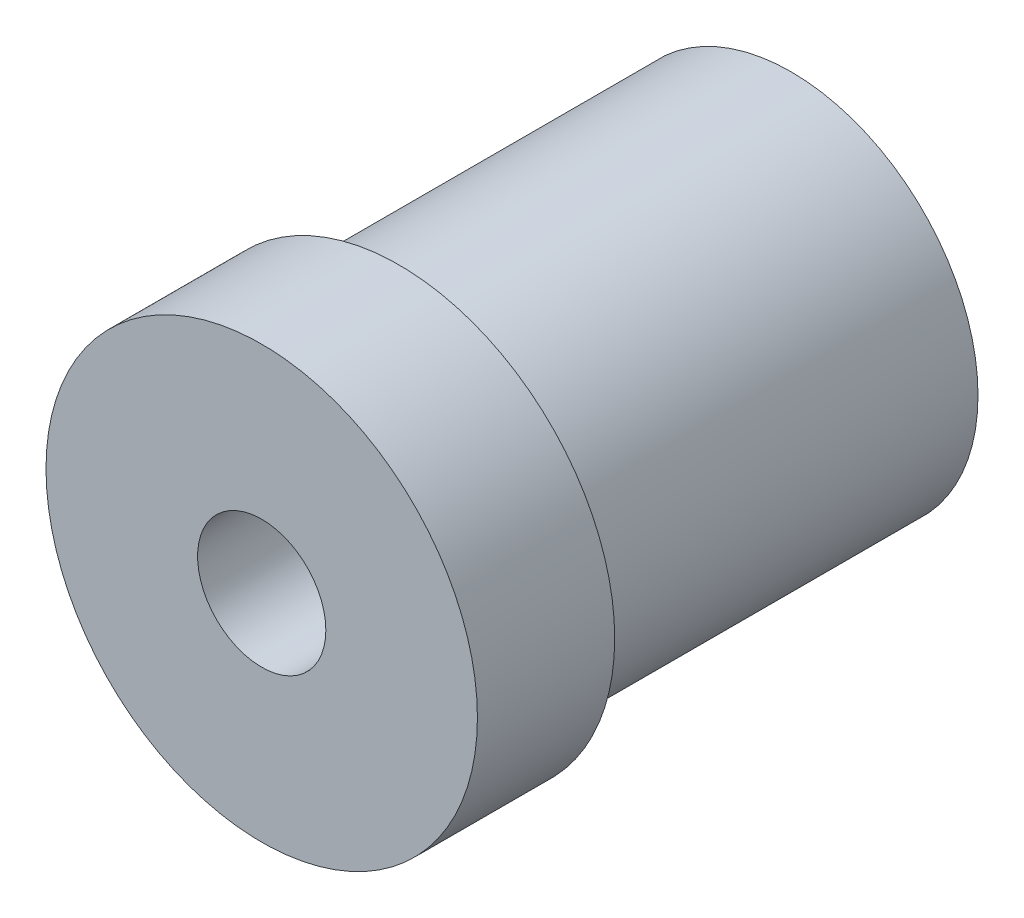
ISO-10303-21;
HEADER;
FILE_DESCRIPTION(('STEP AP214'),'2;1');
FILE_NAME('part.step','',(''),(''),'','','');
FILE_SCHEMA(('AUTOMOTIVE_DESIGN { 1 0 10303 214 1 1 1 1 }'));
ENDSEC;
DATA;
#1=APPLICATION_CONTEXT('core data for automotive mechanical design processes');
#2=APPLICATION_PROTOCOL_DEFINITION('international standard','automotive_design',2000,#1);
#3=PRODUCT_CONTEXT('',#1,'mechanical');
#4=PRODUCT('Part','Part','',(#3));
#5=PRODUCT_RELATED_PRODUCT_CATEGORY('part','',(#4));
#6=PRODUCT_DEFINITION_FORMATION('','',#4);
#7=PRODUCT_DEFINITION_CONTEXT('part definition',#1,'design');
#8=PRODUCT_DEFINITION('design','',#6,#7);
#9=PRODUCT_DEFINITION_SHAPE('','',#8);
#10=(LENGTH_UNIT() NAMED_UNIT(*) SI_UNIT(.MILLI.,.METRE.));
#11=(NAMED_UNIT(*) PLANE_ANGLE_UNIT() SI_UNIT($,.RADIAN.));
#12=(NAMED_UNIT(*) SI_UNIT($,.STERADIAN.) SOLID_ANGLE_UNIT());
#13=UNCERTAINTY_MEASURE_WITH_UNIT(LENGTH_MEASURE(1.E-05),#10,'distance_accuracy_value','');
#14=(GEOMETRIC_REPRESENTATION_CONTEXT(3) GLOBAL_UNCERTAINTY_ASSIGNED_CONTEXT((#13)) GLOBAL_UNIT_ASSIGNED_CONTEXT((#10,
#11,#12)) REPRESENTATION_CONTEXT('',''));
#15=CARTESIAN_POINT('',(0.,0.,0.));
#16=DIRECTION('',(0.,0.,1.));
#17=DIRECTION('',(1.,0.,0.));
#18=AXIS2_PLACEMENT_3D('',#15,#16,#17);
#19=CARTESIAN_POINT('',(0.,0.,0.));
#20=DIRECTION('',(0.,0.,1.));
#21=DIRECTION('',(1.,0.,0.));
#22=AXIS2_PLACEMENT_3D('',#19,#20,#21);
#23=PLANE('',#22);
#24=CARTESIAN_POINT('',(0.,0.,0.));
#25=DIRECTION('',(0.,0.,1.));
#26=DIRECTION('',(1.,0.,0.));
#27=AXIS2_PLACEMENT_3D('',#24,#25,#26);
#28=CIRCLE('',#27,9.525);
#29=CARTESIAN_POINT('',(9.525,0.,0.));
#30=VERTEX_POINT('',#29);
#31=EDGE_CURVE('E39',#30,#30,#28,.T.);
#32=ORIENTED_EDGE('',*,*,#31,.F.);
#33=EDGE_LOOP('',(#32));
#34=FACE_BOUND('',#33,.T.);
#35=CARTESIAN_POINT('',(0.,0.,0.));
#36=DIRECTION('',(0.,0.,1.));
#37=DIRECTION('',(1.,0.,0.));
#38=AXIS2_PLACEMENT_3D('',#35,#36,#37);
#39=CIRCLE('',#38,3.25);
#40=CARTESIAN_POINT('',(3.25,0.,0.));
#41=VERTEX_POINT('',#40);
#42=EDGE_CURVE('E46',#41,#41,#39,.T.);
#43=ORIENTED_EDGE('',*,*,#42,.T.);
#44=EDGE_LOOP('',(#43));
#45=FACE_BOUND('',#44,.T.);
#46=ADVANCED_FACE('F35',(#34,#45),#23,.F.);
#47=CARTESIAN_POINT('',(0.,0.,20.));
#48=DIRECTION('',(0.,0.,-1.));
#49=DIRECTION('',(-1.,0.,0.));
#50=AXIS2_PLACEMENT_3D('',#47,#48,#49);
#51=CYLINDRICAL_SURFACE('',#50,9.525);
#52=CARTESIAN_POINT('',(0.,0.,20.));
#53=DIRECTION('',(0.,0.,1.));
#54=DIRECTION('',(1.,0.,0.));
#55=AXIS2_PLACEMENT_3D('',#52,#53,#54);
#56=CIRCLE('',#55,9.525);
#57=CARTESIAN_POINT('',(9.525,0.,20.));
#58=VERTEX_POINT('',#57);
#59=EDGE_CURVE('E10',#58,#58,#56,.T.);
#60=ORIENTED_EDGE('',*,*,#59,.F.);
#61=EDGE_LOOP('',(#60));
#62=FACE_BOUND('',#61,.T.);
#63=ORIENTED_EDGE('',*,*,#31,.T.);
#64=EDGE_LOOP('',(#63));
#65=FACE_BOUND('',#64,.T.);
#66=ADVANCED_FACE('F37',(#62,#65),#51,.T.);
#67=CARTESIAN_POINT('',(0.,0.,20.));
#68=DIRECTION('',(0.,0.,-1.));
#69=DIRECTION('',(-1.,0.,0.));
#70=AXIS2_PLACEMENT_3D('',#67,#68,#69);
#71=CYLINDRICAL_SURFACE('',#70,3.25);
#72=CARTESIAN_POINT('',(0.,0.,20.));
#73=DIRECTION('',(0.,0.,1.));
#74=DIRECTION('',(1.,0.,0.));
#75=AXIS2_PLACEMENT_3D('',#72,#73,#74);
#76=CIRCLE('',#75,3.25);
#77=CARTESIAN_POINT('',(3.25,0.,20.));
#78=VERTEX_POINT('',#77);
#79=EDGE_CURVE('E51',#78,#78,#76,.T.);
#80=ORIENTED_EDGE('',*,*,#79,.T.);
#81=EDGE_LOOP('',(#80));
#82=FACE_BOUND('',#81,.T.);
#83=ORIENTED_EDGE('',*,*,#42,.F.);
#84=EDGE_LOOP('',(#83));
#85=FACE_BOUND('',#84,.T.);
#86=ADVANCED_FACE('F84',(#82,#85),#71,.F.);
#87=CARTESIAN_POINT('',(0.,0.,27.));
#88=DIRECTION('',(0.,0.,-1.));
#89=DIRECTION('',(-1.,0.,0.));
#90=AXIS2_PLACEMENT_3D('',#87,#88,#89);
#91=CYLINDRICAL_SURFACE('',#90,11.);
#92=CARTESIAN_POINT('',(0.,0.,27.));
#93=DIRECTION('',(0.,0.,1.));
#94=DIRECTION('',(1.,0.,0.));
#95=AXIS2_PLACEMENT_3D('',#92,#93,#94);
#96=CIRCLE('',#95,11.);
#97=CARTESIAN_POINT('',(-11.,0.,27.));
#98=VERTEX_POINT('',#97);
#99=EDGE_CURVE('E50',#98,#98,#96,.T.);
#100=CARTESIAN_POINT('',(0.,0.,20.));
#101=DIRECTION('',(0.,0.,1.));
#102=DIRECTION('',(1.,0.,0.));
#103=AXIS2_PLACEMENT_3D('',#100,#101,#102);
#104=CIRCLE('',#103,11.);
#105=CARTESIAN_POINT('',(-11.,0.,20.));
#106=VERTEX_POINT('',#105);
#107=EDGE_CURVE('E54',#106,#106,#104,.T.);
#108=CARTESIAN_POINT('',(-11.,0.,27.));
#109=CARTESIAN_POINT('',(-11.,0.,26.9270833333333));
#110=CARTESIAN_POINT('',(-11.,0.,26.8541666666667));
#111=CARTESIAN_POINT('',(-11.,0.,26.7083333333333));
#112=CARTESIAN_POINT('',(-11.,0.,26.6354166666667));
#113=CARTESIAN_POINT('',(-11.,0.,26.4895833333333));
#114=CARTESIAN_POINT('',(-11.,0.,26.4166666666667));
#115=CARTESIAN_POINT('',(-11.,0.,26.2708333333333));
#116=CARTESIAN_POINT('',(-11.,0.,26.1979166666667));
#117=CARTESIAN_POINT('',(-11.,0.,26.0520833333333));
#118=CARTESIAN_POINT('',(-11.,0.,25.9791666666667));
#119=CARTESIAN_POINT('',(-11.,0.,25.8333333333333));
#120=CARTESIAN_POINT('',(-11.,0.,25.7604166666667));
#121=CARTESIAN_POINT('',(-11.,0.,25.6145833333333));
#122=CARTESIAN_POINT('',(-11.,0.,25.5416666666667));
#123=CARTESIAN_POINT('',(-11.,0.,25.3958333333333));
#124=CARTESIAN_POINT('',(-11.,0.,25.3229166666667));
#125=CARTESIAN_POINT('',(-11.,0.,25.1770833333333));
#126=CARTESIAN_POINT('',(-11.,0.,25.1041666666667));
#127=CARTESIAN_POINT('',(-11.,0.,24.9583333333333));
#128=CARTESIAN_POINT('',(-11.,0.,24.8854166666667));
#129=CARTESIAN_POINT('',(-11.,0.,24.7395833333333));
#130=CARTESIAN_POINT('',(-11.,0.,24.6666666666667));
#131=CARTESIAN_POINT('',(-11.,0.,24.5208333333333));
#132=CARTESIAN_POINT('',(-11.,0.,24.4479166666667));
#133=CARTESIAN_POINT('',(-11.,0.,24.3020833333333));
#134=CARTESIAN_POINT('',(-11.,0.,24.2291666666667));
#135=CARTESIAN_POINT('',(-11.,0.,24.0833333333333));
#136=CARTESIAN_POINT('',(-11.,0.,24.0104166666667));
#137=CARTESIAN_POINT('',(-11.,0.,23.8645833333333));
#138=CARTESIAN_POINT('',(-11.,0.,23.7916666666667));
#139=CARTESIAN_POINT('',(-11.,0.,23.6458333333333));
#140=CARTESIAN_POINT('',(-11.,0.,23.5729166666667));
#141=CARTESIAN_POINT('',(-11.,0.,23.4270833333333));
#142=CARTESIAN_POINT('',(-11.,0.,23.3541666666667));
#143=CARTESIAN_POINT('',(-11.,0.,23.2083333333333));
#144=CARTESIAN_POINT('',(-11.,0.,23.1354166666667));
#145=CARTESIAN_POINT('',(-11.,0.,22.9895833333333));
#146=CARTESIAN_POINT('',(-11.,0.,22.9166666666667));
#147=CARTESIAN_POINT('',(-11.,0.,22.7708333333333));
#148=CARTESIAN_POINT('',(-11.,0.,22.6979166666667));
#149=CARTESIAN_POINT('',(-11.,0.,22.5520833333333));
#150=CARTESIAN_POINT('',(-11.,0.,22.4791666666667));
#151=CARTESIAN_POINT('',(-11.,0.,22.3333333333333));
#152=CARTESIAN_POINT('',(-11.,0.,22.2604166666667));
#153=CARTESIAN_POINT('',(-11.,0.,22.1145833333333));
#154=CARTESIAN_POINT('',(-11.,0.,22.0416666666667));
#155=CARTESIAN_POINT('',(-11.,0.,21.8958333333333));
#156=CARTESIAN_POINT('',(-11.,0.,21.8229166666667));
#157=CARTESIAN_POINT('',(-11.,0.,21.6770833333333));
#158=CARTESIAN_POINT('',(-11.,0.,21.6041666666667));
#159=CARTESIAN_POINT('',(-11.,0.,21.4583333333333));
#160=CARTESIAN_POINT('',(-11.,0.,21.3854166666667));
#161=CARTESIAN_POINT('',(-11.,0.,21.2395833333333));
#162=CARTESIAN_POINT('',(-11.,0.,21.1666666666667));
#163=CARTESIAN_POINT('',(-11.,0.,21.0208333333333));
#164=CARTESIAN_POINT('',(-11.,0.,20.9479166666667));
#165=CARTESIAN_POINT('',(-11.,0.,20.8020833333333));
#166=CARTESIAN_POINT('',(-11.,0.,20.7291666666667));
#167=CARTESIAN_POINT('',(-11.,0.,20.5833333333333));
#168=CARTESIAN_POINT('',(-11.,0.,20.5104166666667));
#169=CARTESIAN_POINT('',(-11.,0.,20.3645833333333));
#170=CARTESIAN_POINT('',(-11.,0.,20.2916666666667));
#171=CARTESIAN_POINT('',(-11.,0.,20.1458333333333));
#172=CARTESIAN_POINT('',(-11.,0.,20.0729166666667));
#173=CARTESIAN_POINT('',(-11.,0.,20.));
#174=B_SPLINE_CURVE_WITH_KNOTS('',3,(#108,#109,#110,#111,#112,#113,#114,#115,#116,#117,#118,
#119,#120,#121,#122,#123,#124,#125,#126,#127,#128,#129,#130,#131,#132,#133,#134,#135,#136,#137,
#138,#139,#140,#141,#142,#143,#144,#145,#146,#147,#148,#149,#150,#151,#152,#153,#154,#155,#156,
#157,#158,#159,#160,#161,#162,#163,#164,#165,#166,#167,#168,#169,#170,#171,#172,#173),
.UNSPECIFIED.,.F.,.F.,(4,2,2,2,2,2,2,2,2,2,2,2,2,2,2,2,2,2,2,2,2,2,2,2,2,2,2,2,2,2,2,2,4),(0.,
0.218749999999997,0.437499999999997,0.656249999999997,0.874999999999997,1.09375,1.3125,1.53125,
1.75,1.96875,2.1875,2.40625,2.625,2.84375,3.0625,3.28125,3.5,3.71875,3.9375,4.15625,4.375,
4.59375,4.8125,5.03125,5.25,5.46875,5.6875,5.90624999999999,6.125,6.34375,6.5625,6.78125,7.),.UNSPECIFIED.);
#175=EDGE_CURVE('BSEAM78',#98,#106,#174,.T.);
#176=ORIENTED_EDGE('',*,*,#99,.F.);
#177=ORIENTED_EDGE('',*,*,#107,.T.);
#178=ORIENTED_EDGE('',*,*,#175,.T.);
#179=ORIENTED_EDGE('',*,*,#175,.F.);
#180=EDGE_LOOP('',(#176,#178,#177,#179));
#181=FACE_BOUND('',#180,.T.);
#182=ADVANCED_FACE('F78',(#181),#91,.T.);
#183=CARTESIAN_POINT('',(0.,0.,27.));
#184=DIRECTION('',(0.,0.,1.));
#185=DIRECTION('',(1.,0.,0.));
#186=AXIS2_PLACEMENT_3D('',#183,#184,#185);
#187=PLANE('',#186);
#188=CARTESIAN_POINT('',(0.,0.,27.));
#189=DIRECTION('',(0.,0.,1.));
#190=DIRECTION('',(1.,0.,0.));
#191=AXIS2_PLACEMENT_3D('',#188,#189,#190);
#192=CIRCLE('',#191,3.27);
#193=CARTESIAN_POINT('',(3.27,0.,27.));
#194=VERTEX_POINT('',#193);
#195=EDGE_CURVE('E60',#194,#194,#192,.T.);
#196=ORIENTED_EDGE('',*,*,#195,.F.);
#197=EDGE_LOOP('',(#196));
#198=FACE_BOUND('',#197,.T.);
#199=ORIENTED_EDGE('',*,*,#99,.T.);
#200=EDGE_LOOP('',(#199));
#201=FACE_BOUND('',#200,.T.);
#202=ADVANCED_FACE('F75',(#198,#201),#187,.T.);
#203=CARTESIAN_POINT('',(0.,0.,20.));
#204=DIRECTION('',(0.,0.,1.));
#205=DIRECTION('',(1.,0.,0.));
#206=AXIS2_PLACEMENT_3D('',#203,#204,#205);
#207=PLANE('',#206);
#208=ORIENTED_EDGE('',*,*,#59,.T.);
#209=EDGE_LOOP('',(#208));
#210=FACE_BOUND('',#209,.T.);
#211=ORIENTED_EDGE('',*,*,#107,.F.);
#212=EDGE_LOOP('',(#211));
#213=FACE_BOUND('',#212,.T.);
#214=ADVANCED_FACE('F71',(#210,#213),#207,.F.);
#215=CARTESIAN_POINT('',(0.,0.,20.));
#216=DIRECTION('',(0.,0.,1.));
#217=DIRECTION('',(1.,0.,0.));
#218=AXIS2_PLACEMENT_3D('',#215,#216,#217);
#219=CYLINDRICAL_SURFACE('',#218,3.27);
#220=CARTESIAN_POINT('',(0.,0.,20.));
#221=DIRECTION('',(0.,0.,1.));
#222=DIRECTION('',(1.,0.,0.));
#223=AXIS2_PLACEMENT_3D('',#220,#221,#222);
#224=CIRCLE('',#223,3.27);
#225=CARTESIAN_POINT('',(3.27,0.,20.));
#226=VERTEX_POINT('',#225);
#227=EDGE_CURVE('E55',#226,#226,#224,.T.);
#228=CARTESIAN_POINT('',(3.27,0.,20.));
#229=CARTESIAN_POINT('',(3.27,0.,20.0729166666667));
#230=CARTESIAN_POINT('',(3.27,0.,20.1458333333333));
#231=CARTESIAN_POINT('',(3.27,0.,20.2916666666667));
#232=CARTESIAN_POINT('',(3.27,0.,20.3645833333333));
#233=CARTESIAN_POINT('',(3.27,0.,20.5104166666667));
#234=CARTESIAN_POINT('',(3.27,0.,20.5833333333333));
#235=CARTESIAN_POINT('',(3.27,0.,20.7291666666667));
#236=CARTESIAN_POINT('',(3.27,0.,20.8020833333333));
#237=CARTESIAN_POINT('',(3.27,0.,20.9479166666667));
#238=CARTESIAN_POINT('',(3.27,0.,21.0208333333333));
#239=CARTESIAN_POINT('',(3.27,0.,21.1666666666667));
#240=CARTESIAN_POINT('',(3.27,0.,21.2395833333333));
#241=CARTESIAN_POINT('',(3.27,0.,21.3854166666667));
#242=CARTESIAN_POINT('',(3.27,0.,21.4583333333333));
#243=CARTESIAN_POINT('',(3.27,0.,21.6041666666667));
#244=CARTESIAN_POINT('',(3.27,0.,21.6770833333333));
#245=CARTESIAN_POINT('',(3.27,0.,21.8229166666667));
#246=CARTESIAN_POINT('',(3.27,0.,21.8958333333333));
#247=CARTESIAN_POINT('',(3.27,0.,22.0416666666667));
#248=CARTESIAN_POINT('',(3.27,0.,22.1145833333333));
#249=CARTESIAN_POINT('',(3.27,0.,22.2604166666667));
#250=CARTESIAN_POINT('',(3.27,0.,22.3333333333333));
#251=CARTESIAN_POINT('',(3.27,0.,22.4791666666667));
#252=CARTESIAN_POINT('',(3.27,0.,22.5520833333333));
#253=CARTESIAN_POINT('',(3.27,0.,22.6979166666667));
#254=CARTESIAN_POINT('',(3.27,0.,22.7708333333333));
#255=CARTESIAN_POINT('',(3.27,0.,22.9166666666667));
#256=CARTESIAN_POINT('',(3.27,0.,22.9895833333333));
#257=CARTESIAN_POINT('',(3.27,0.,23.1354166666667));
#258=CARTESIAN_POINT('',(3.27,0.,23.2083333333333));
#259=CARTESIAN_POINT('',(3.27,0.,23.3541666666667));
#260=CARTESIAN_POINT('',(3.27,0.,23.4270833333333));
#261=CARTESIAN_POINT('',(3.27,0.,23.5729166666667));
#262=CARTESIAN_POINT('',(3.27,0.,23.6458333333333));
#263=CARTESIAN_POINT('',(3.27,0.,23.7916666666667));
#264=CARTESIAN_POINT('',(3.27,0.,23.8645833333333));
#265=CARTESIAN_POINT('',(3.27,0.,24.0104166666667));
#266=CARTESIAN_POINT('',(3.27,0.,24.0833333333333));
#267=CARTESIAN_POINT('',(3.27,0.,24.2291666666667));
#268=CARTESIAN_POINT('',(3.27,0.,24.3020833333333));
#269=CARTESIAN_POINT('',(3.27,0.,24.4479166666667));
#270=CARTESIAN_POINT('',(3.27,0.,24.5208333333333));
#271=CARTESIAN_POINT('',(3.27,0.,24.6666666666667));
#272=CARTESIAN_POINT('',(3.27,0.,24.7395833333333));
#273=CARTESIAN_POINT('',(3.27,0.,24.8854166666667));
#274=CARTESIAN_POINT('',(3.27,0.,24.9583333333333));
#275=CARTESIAN_POINT('',(3.27,0.,25.1041666666667));
#276=CARTESIAN_POINT('',(3.27,0.,25.1770833333333));
#277=CARTESIAN_POINT('',(3.27,0.,25.3229166666667));
#278=CARTESIAN_POINT('',(3.27,0.,25.3958333333333));
#279=CARTESIAN_POINT('',(3.27,0.,25.5416666666667));
#280=CARTESIAN_POINT('',(3.27,0.,25.6145833333333));
#281=CARTESIAN_POINT('',(3.27,0.,25.7604166666667));
#282=CARTESIAN_POINT('',(3.27,0.,25.8333333333333));
#283=CARTESIAN_POINT('',(3.27,0.,25.9791666666667));
#284=CARTESIAN_POINT('',(3.27,0.,26.0520833333333));
#285=CARTESIAN_POINT('',(3.27,0.,26.1979166666667));
#286=CARTESIAN_POINT('',(3.27,0.,26.2708333333333));
#287=CARTESIAN_POINT('',(3.27,0.,26.4166666666667));
#288=CARTESIAN_POINT('',(3.27,0.,26.4895833333333));
#289=CARTESIAN_POINT('',(3.27,0.,26.6354166666667));
#290=CARTESIAN_POINT('',(3.27,0.,26.7083333333333));
#291=CARTESIAN_POINT('',(3.27,0.,26.8541666666667));
#292=CARTESIAN_POINT('',(3.27,0.,26.9270833333333));
#293=CARTESIAN_POINT('',(3.27,0.,27.));
#294=B_SPLINE_CURVE_WITH_KNOTS('',3,(#228,#229,#230,#231,#232,#233,#234,#235,#236,#237,#238,
#239,#240,#241,#242,#243,#244,#245,#246,#247,#248,#249,#250,#251,#252,#253,#254,#255,#256,#257,
#258,#259,#260,#261,#262,#263,#264,#265,#266,#267,#268,#269,#270,#271,#272,#273,#274,#275,#276,
#277,#278,#279,#280,#281,#282,#283,#284,#285,#286,#287,#288,#289,#290,#291,#292,#293),
.UNSPECIFIED.,.F.,.F.,(4,2,2,2,2,2,2,2,2,2,2,2,2,2,2,2,2,2,2,2,2,2,2,2,2,2,2,2,2,2,2,2,4),(0.,
0.21875,0.4375,0.656250000000001,0.875000000000001,1.09375,1.3125,1.53125,1.75,1.96875,2.1875,
2.40625,2.625,2.84375,3.0625,3.28125,3.5,3.71875,3.9375,4.15625,4.375,4.59375,4.8125,5.03125,
5.25,5.46875,5.6875,5.90625,6.125,6.34375,6.5625,6.78125,7.),.UNSPECIFIED.);
#295=EDGE_CURVE('BSEAM68',#226,#194,#294,.T.);
#296=ORIENTED_EDGE('',*,*,#227,.F.);
#297=ORIENTED_EDGE('',*,*,#195,.T.);
#298=ORIENTED_EDGE('',*,*,#295,.T.);
#299=ORIENTED_EDGE('',*,*,#295,.F.);
#300=EDGE_LOOP('',(#296,#298,#297,#299));
#301=FACE_BOUND('',#300,.T.);
#302=ADVANCED_FACE('F68',(#301),#219,.F.);
#303=CARTESIAN_POINT('',(0.,0.,20.));
#304=DIRECTION('',(0.,0.,1.));
#305=DIRECTION('',(1.,0.,0.));
#306=AXIS2_PLACEMENT_3D('',#303,#304,#305);
#307=PLANE('',#306);
#308=ORIENTED_EDGE('',*,*,#79,.F.);
#309=EDGE_LOOP('',(#308));
#310=FACE_BOUND('',#309,.T.);
#311=ORIENTED_EDGE('',*,*,#227,.T.);
#312=EDGE_LOOP('',(#311));
#313=FACE_BOUND('',#312,.T.);
#314=ADVANCED_FACE('F66',(#310,#313),#307,.T.);
#315=CLOSED_SHELL('',(#46,#66,#86,#182,#202,#214,#302,#314));
#316=MANIFOLD_SOLID_BREP('B2',#315);
#317=ADVANCED_BREP_SHAPE_REPRESENTATION('',(#18,#316),#14);
#318=SHAPE_DEFINITION_REPRESENTATION(#9,#317);
ENDSEC;
END-ISO-10303-21;
